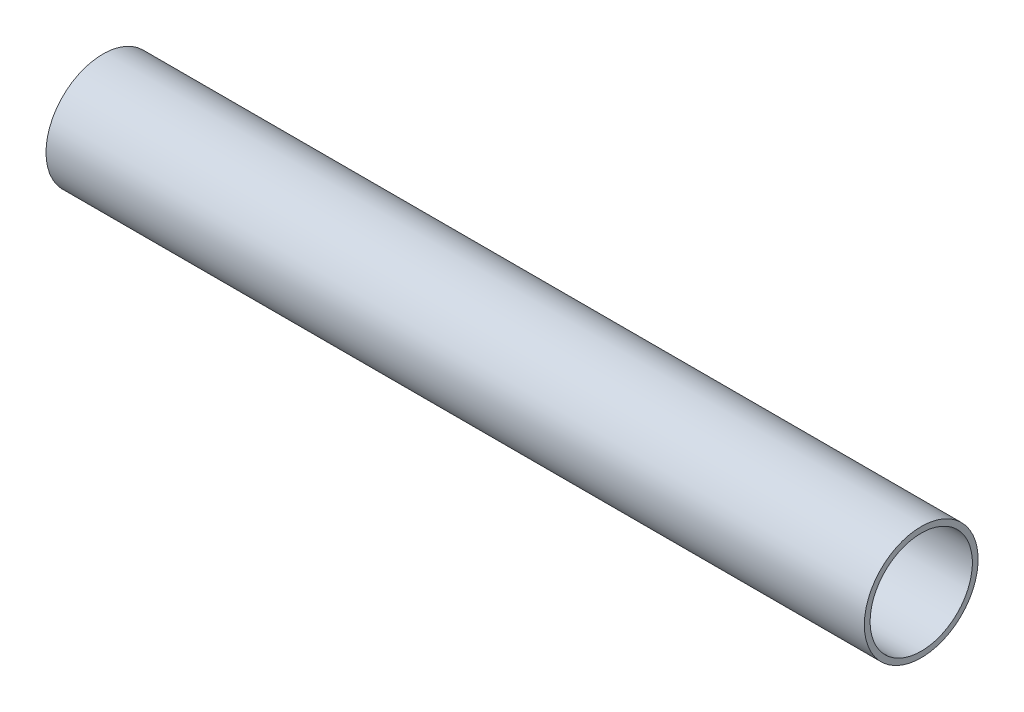
ISO-10303-21;
HEADER;
FILE_DESCRIPTION(('STEP AP214'),'2;1');
FILE_NAME('part.step','',(''),(''),'','','');
FILE_SCHEMA(('AUTOMOTIVE_DESIGN { 1 0 10303 214 1 1 1 1 }'));
ENDSEC;
DATA;
#1=APPLICATION_CONTEXT('core data for automotive mechanical design processes');
#2=APPLICATION_PROTOCOL_DEFINITION('international standard','automotive_design',2000,#1);
#3=PRODUCT_CONTEXT('',#1,'mechanical');
#4=PRODUCT('Part','Part','',(#3));
#5=PRODUCT_RELATED_PRODUCT_CATEGORY('part','',(#4));
#6=PRODUCT_DEFINITION_FORMATION('','',#4);
#7=PRODUCT_DEFINITION_CONTEXT('part definition',#1,'design');
#8=PRODUCT_DEFINITION('design','',#6,#7);
#9=PRODUCT_DEFINITION_SHAPE('','',#8);
#10=(LENGTH_UNIT() NAMED_UNIT(*) SI_UNIT(.MILLI.,.METRE.));
#11=(NAMED_UNIT(*) PLANE_ANGLE_UNIT() SI_UNIT($,.RADIAN.));
#12=(NAMED_UNIT(*) SI_UNIT($,.STERADIAN.) SOLID_ANGLE_UNIT());
#13=UNCERTAINTY_MEASURE_WITH_UNIT(LENGTH_MEASURE(1.E-05),#10,'distance_accuracy_value','');
#14=(GEOMETRIC_REPRESENTATION_CONTEXT(3) GLOBAL_UNCERTAINTY_ASSIGNED_CONTEXT((#13)) GLOBAL_UNIT_ASSIGNED_CONTEXT((#10,
#11,#12)) REPRESENTATION_CONTEXT('',''));
#15=CARTESIAN_POINT('',(0.,0.,0.));
#16=DIRECTION('',(0.,0.,1.));
#17=DIRECTION('',(1.,0.,0.));
#18=AXIS2_PLACEMENT_3D('',#15,#16,#17);
#19=CARTESIAN_POINT('',(0.,12.5,0.));
#20=DIRECTION('',(1.,0.,0.));
#21=DIRECTION('',(0.,0.,-1.));
#22=AXIS2_PLACEMENT_3D('',#19,#20,#21);
#23=PLANE('',#22);
#24=CARTESIAN_POINT('',(0.,0.,0.));
#25=DIRECTION('',(-1.,0.,0.));
#26=DIRECTION('',(0.,0.,1.));
#27=AXIS2_PLACEMENT_3D('',#24,#25,#26);
#28=CIRCLE('',#27,12.5);
#29=CARTESIAN_POINT('',(0.,0.,12.5));
#30=VERTEX_POINT('',#29);
#31=EDGE_CURVE('E76',#30,#30,#28,.T.);
#32=ORIENTED_EDGE('',*,*,#31,.F.);
#33=EDGE_LOOP('',(#32));
#34=FACE_BOUND('',#33,.T.);
#35=CARTESIAN_POINT('',(0.,0.,0.));
#36=DIRECTION('',(-1.,0.,0.));
#37=DIRECTION('',(0.,0.,1.));
#38=AXIS2_PLACEMENT_3D('',#35,#36,#37);
#39=CIRCLE('',#38,13.9040094070302);
#40=CARTESIAN_POINT('',(0.,0.,13.9040094070302));
#41=VERTEX_POINT('',#40);
#42=EDGE_CURVE('E10',#41,#41,#39,.T.);
#43=ORIENTED_EDGE('',*,*,#42,.T.);
#44=EDGE_LOOP('',(#43));
#45=FACE_BOUND('',#44,.T.);
#46=ADVANCED_FACE('F41',(#34,#45),#23,.F.);
#47=CARTESIAN_POINT('',(-93.5747663551402,0.,0.));
#48=DIRECTION('',(-1.,0.,0.));
#49=DIRECTION('',(0.,0.,1.));
#50=AXIS2_PLACEMENT_3D('',#47,#48,#49);
#51=CYLINDRICAL_SURFACE('',#50,13.9040094070302);
#52=ORIENTED_EDGE('',*,*,#42,.F.);
#53=EDGE_LOOP('',(#52));
#54=FACE_BOUND('',#53,.T.);
#55=CARTESIAN_POINT('',(200.,0.,0.));
#56=DIRECTION('',(-1.,0.,0.));
#57=DIRECTION('',(0.,0.,1.));
#58=AXIS2_PLACEMENT_3D('',#55,#56,#57);
#59=CIRCLE('',#58,13.9040094070302);
#60=CARTESIAN_POINT('',(200.,0.,13.9040094070302));
#61=VERTEX_POINT('',#60);
#62=EDGE_CURVE('E48',#61,#61,#59,.T.);
#63=ORIENTED_EDGE('',*,*,#62,.T.);
#64=EDGE_LOOP('',(#63));
#65=FACE_BOUND('',#64,.T.);
#66=ADVANCED_FACE('F84',(#54,#65),#51,.T.);
#67=CARTESIAN_POINT('',(200.,12.5,0.));
#68=DIRECTION('',(-1.,0.,0.));
#69=DIRECTION('',(0.,0.,1.));
#70=AXIS2_PLACEMENT_3D('',#67,#68,#69);
#71=PLANE('',#70);
#72=ORIENTED_EDGE('',*,*,#62,.F.);
#73=EDGE_LOOP('',(#72));
#74=FACE_BOUND('',#73,.T.);
#75=CARTESIAN_POINT('',(200.,0.,0.));
#76=DIRECTION('',(-1.,0.,0.));
#77=DIRECTION('',(0.,0.,1.));
#78=AXIS2_PLACEMENT_3D('',#75,#76,#77);
#79=CIRCLE('',#78,12.5);
#80=CARTESIAN_POINT('',(200.,0.,12.5));
#81=VERTEX_POINT('',#80);
#82=EDGE_CURVE('E53',#81,#81,#79,.T.);
#83=ORIENTED_EDGE('',*,*,#82,.T.);
#84=EDGE_LOOP('',(#83));
#85=FACE_BOUND('',#84,.T.);
#86=ADVANCED_FACE('F88',(#74,#85),#71,.F.);
#87=CARTESIAN_POINT('',(-93.5747663551402,0.,0.));
#88=DIRECTION('',(-1.,0.,0.));
#89=DIRECTION('',(0.,0.,1.));
#90=AXIS2_PLACEMENT_3D('',#87,#88,#89);
#91=CYLINDRICAL_SURFACE('',#90,12.5);
#92=ORIENTED_EDGE('',*,*,#82,.F.);
#93=EDGE_LOOP('',(#92));
#94=FACE_BOUND('',#93,.T.);
#95=CARTESIAN_POINT('',(100.862591781285,0.,0.));
#96=DIRECTION('',(-1.,0.,0.));
#97=DIRECTION('',(0.,0.,1.));
#98=AXIS2_PLACEMENT_3D('',#95,#96,#97);
#99=CIRCLE('',#98,12.5);
#100=CARTESIAN_POINT('',(100.862591781285,0.,12.5));
#101=VERTEX_POINT('',#100);
#102=EDGE_CURVE('E58',#101,#101,#99,.T.);
#103=ORIENTED_EDGE('',*,*,#102,.T.);
#104=EDGE_LOOP('',(#103));
#105=FACE_BOUND('',#104,.T.);
#106=ADVANCED_FACE('F93',(#94,#105),#91,.F.);
#107=CARTESIAN_POINT('',(100.862591781285,7.56390713838868,0.));
#108=DIRECTION('',(-1.,0.,0.));
#109=DIRECTION('',(0.,0.,1.));
#110=AXIS2_PLACEMENT_3D('',#107,#108,#109);
#111=PLANE('',#110);
#112=ORIENTED_EDGE('',*,*,#102,.F.);
#113=EDGE_LOOP('',(#112));
#114=FACE_BOUND('',#113,.T.);
#115=CARTESIAN_POINT('',(100.862591781285,0.,0.));
#116=DIRECTION('',(-1.,0.,0.));
#117=DIRECTION('',(0.,0.,1.));
#118=AXIS2_PLACEMENT_3D('',#115,#116,#117);
#119=CIRCLE('',#118,7.56390713838868);
#120=CARTESIAN_POINT('',(100.862591781285,0.,7.56390713838868));
#121=VERTEX_POINT('',#120);
#122=EDGE_CURVE('E64',#121,#121,#119,.T.);
#123=ORIENTED_EDGE('',*,*,#122,.T.);
#124=EDGE_LOOP('',(#123));
#125=FACE_BOUND('',#124,.T.);
#126=ADVANCED_FACE('F99',(#114,#125),#111,.F.);
#127=CARTESIAN_POINT('',(98.8625917812853,0.,0.));
#128=DIRECTION('',(1.,0.,0.));
#129=DIRECTION('',(0.,0.,-1.));
#130=AXIS2_PLACEMENT_3D('',#127,#128,#129);
#131=CONICAL_SURFACE('',#130,6.25,0.581247972926078);
#132=ORIENTED_EDGE('',*,*,#122,.F.);
#133=EDGE_LOOP('',(#132));
#134=FACE_BOUND('',#133,.T.);
#135=CARTESIAN_POINT('',(98.8625917812853,0.,0.));
#136=DIRECTION('',(-1.,0.,0.));
#137=DIRECTION('',(0.,0.,1.));
#138=AXIS2_PLACEMENT_3D('',#135,#136,#137);
#139=CIRCLE('',#138,6.25);
#140=CARTESIAN_POINT('',(98.8625917812853,0.,6.25));
#141=VERTEX_POINT('',#140);
#142=EDGE_CURVE('E68',#141,#141,#139,.T.);
#143=ORIENTED_EDGE('',*,*,#142,.T.);
#144=EDGE_LOOP('',(#143));
#145=FACE_BOUND('',#144,.T.);
#146=ADVANCED_FACE('F103',(#134,#145),#131,.F.);
#147=CARTESIAN_POINT('',(98.8625917812853,12.5,0.));
#148=DIRECTION('',(1.,0.,0.));
#149=DIRECTION('',(0.,0.,-1.));
#150=AXIS2_PLACEMENT_3D('',#147,#148,#149);
#151=PLANE('',#150);
#152=ORIENTED_EDGE('',*,*,#142,.F.);
#153=EDGE_LOOP('',(#152));
#154=FACE_BOUND('',#153,.T.);
#155=CARTESIAN_POINT('',(98.8625917812853,0.,0.));
#156=DIRECTION('',(-1.,0.,0.));
#157=DIRECTION('',(0.,0.,1.));
#158=AXIS2_PLACEMENT_3D('',#155,#156,#157);
#159=CIRCLE('',#158,12.5);
#160=CARTESIAN_POINT('',(98.8625917812853,0.,12.5));
#161=VERTEX_POINT('',#160);
#162=EDGE_CURVE('E72',#161,#161,#159,.T.);
#163=ORIENTED_EDGE('',*,*,#162,.T.);
#164=EDGE_LOOP('',(#163));
#165=FACE_BOUND('',#164,.T.);
#166=ADVANCED_FACE('F107',(#154,#165),#151,.F.);
#167=CARTESIAN_POINT('',(-93.5747663551402,0.,0.));
#168=DIRECTION('',(-1.,0.,0.));
#169=DIRECTION('',(0.,0.,1.));
#170=AXIS2_PLACEMENT_3D('',#167,#168,#169);
#171=CYLINDRICAL_SURFACE('',#170,12.5);
#172=ORIENTED_EDGE('',*,*,#162,.F.);
#173=EDGE_LOOP('',(#172));
#174=FACE_BOUND('',#173,.T.);
#175=ORIENTED_EDGE('',*,*,#31,.T.);
#176=EDGE_LOOP('',(#175));
#177=FACE_BOUND('',#176,.T.);
#178=ADVANCED_FACE('F81',(#174,#177),#171,.F.);
#179=CLOSED_SHELL('',(#46,#66,#86,#106,#126,#146,#166,#178));
#180=MANIFOLD_SOLID_BREP('B2',#179);
#181=ADVANCED_BREP_SHAPE_REPRESENTATION('',(#18,#180),#14);
#182=SHAPE_DEFINITION_REPRESENTATION(#9,#181);
ENDSEC;
END-ISO-10303-21;
